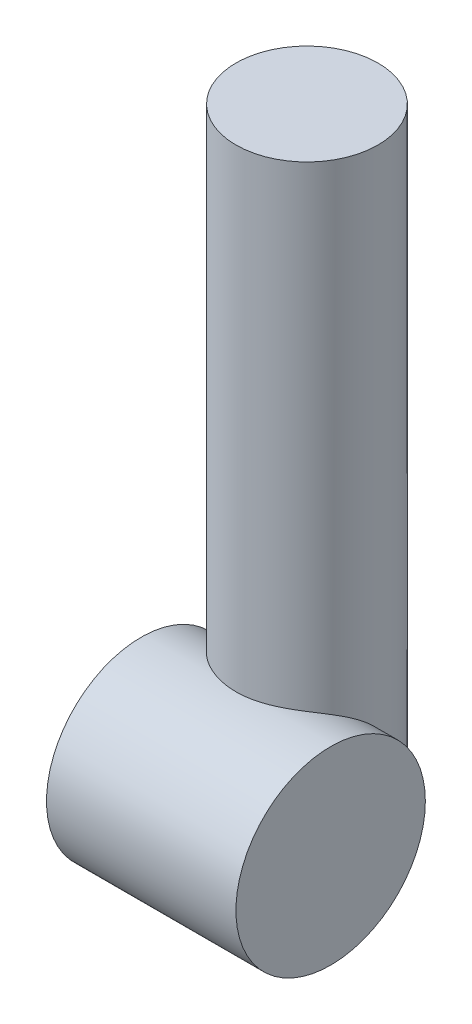
ISO-10303-21;
HEADER;
FILE_DESCRIPTION(('STEP AP214'),'2;1');
FILE_NAME('part.step','',(''),(''),'','','');
FILE_SCHEMA(('AUTOMOTIVE_DESIGN { 1 0 10303 214 1 1 1 1 }'));
ENDSEC;
DATA;
#1=APPLICATION_CONTEXT('core data for automotive mechanical design processes');
#2=APPLICATION_PROTOCOL_DEFINITION('international standard','automotive_design',2000,#1);
#3=PRODUCT_CONTEXT('',#1,'mechanical');
#4=PRODUCT('Part','Part','',(#3));
#5=PRODUCT_RELATED_PRODUCT_CATEGORY('part','',(#4));
#6=PRODUCT_DEFINITION_FORMATION('','',#4);
#7=PRODUCT_DEFINITION_CONTEXT('part definition',#1,'design');
#8=PRODUCT_DEFINITION('design','',#6,#7);
#9=PRODUCT_DEFINITION_SHAPE('','',#8);
#10=(LENGTH_UNIT() NAMED_UNIT(*) SI_UNIT(.MILLI.,.METRE.));
#11=(NAMED_UNIT(*) PLANE_ANGLE_UNIT() SI_UNIT($,.RADIAN.));
#12=(NAMED_UNIT(*) SI_UNIT($,.STERADIAN.) SOLID_ANGLE_UNIT());
#13=UNCERTAINTY_MEASURE_WITH_UNIT(LENGTH_MEASURE(1.E-05),#10,'distance_accuracy_value','');
#14=(GEOMETRIC_REPRESENTATION_CONTEXT(3) GLOBAL_UNCERTAINTY_ASSIGNED_CONTEXT((#13)) GLOBAL_UNIT_ASSIGNED_CONTEXT((#10,
#11,#12)) REPRESENTATION_CONTEXT('',''));
#15=CARTESIAN_POINT('',(0.,0.,0.));
#16=DIRECTION('',(0.,0.,1.));
#17=DIRECTION('',(1.,0.,0.));
#18=AXIS2_PLACEMENT_3D('',#15,#16,#17);
#19=CARTESIAN_POINT('',(0.,240.,0.));
#20=DIRECTION('',(0.,-1.,0.));
#21=DIRECTION('',(0.,0.,-1.));
#22=AXIS2_PLACEMENT_3D('',#19,#20,#21);
#23=CYLINDRICAL_SURFACE('',#22,30.);
#24=CARTESIAN_POINT('',(0.,240.,0.));
#25=DIRECTION('',(0.,1.,0.));
#26=DIRECTION('',(0.,0.,1.));
#27=AXIS2_PLACEMENT_3D('',#24,#25,#26);
#28=CIRCLE('',#27,30.);
#29=CARTESIAN_POINT('',(0.,240.,30.));
#30=VERTEX_POINT('',#29);
#31=EDGE_CURVE('E44',#30,#30,#28,.T.);
#32=ORIENTED_EDGE('',*,*,#31,.F.);
#33=EDGE_LOOP('',(#32));
#34=FACE_BOUND('',#33,.T.);
#35=CARTESIAN_POINT('',(28.2842712474619,0.,-10.));
#36=CARTESIAN_POINT('',(28.284268353884,0.321279484019381,-10.0000001693115));
#37=CARTESIAN_POINT('',(28.2856402245259,0.64254457452302,-9.99612898652597));
#38=CARTESIAN_POINT('',(28.2911069328653,1.28486128617135,-9.98064955979972));
#39=CARTESIAN_POINT('',(28.2952017377202,1.605912909844,-9.9690414091781));
#40=CARTESIAN_POINT('',(28.3115291915471,2.56838958003852,-9.92262429609089));
#41=CARTESIAN_POINT('',(28.3278048943818,3.20922926254307,-9.87622266889922));
#42=CARTESIAN_POINT('',(28.3705667873075,4.48716586979845,-9.7527011091298));
#43=CARTESIAN_POINT('',(28.3970467036467,5.12426485053955,-9.67560005020183));
#44=CARTESIAN_POINT('',(28.459300301829,6.39358236731506,-9.49092820174421));
#45=CARTESIAN_POINT('',(28.4950740724151,7.02580085668841,-9.38335712126867));
#46=CARTESIAN_POINT('',(28.5746449864494,8.28331186477431,-9.1381753902189));
#47=CARTESIAN_POINT('',(28.6184353356872,8.90860977648034,-9.00059015845621));
#48=CARTESIAN_POINT('',(28.7125419599859,10.1514250707658,-8.69571008565138));
#49=CARTESIAN_POINT('',(28.7628583396231,10.7689423284901,-8.52841476850442));
#50=CARTESIAN_POINT('',(28.8682561552566,11.9948696045897,-8.16453709981523));
#51=CARTESIAN_POINT('',(28.9233375202066,12.603279758594,-7.9679551849069));
#52=CARTESIAN_POINT('',(29.0362840012873,13.809693639373,-7.5459828416025));
#53=CARTESIAN_POINT('',(29.0941490216522,14.4076977231847,-7.32059340382832));
#54=CARTESIAN_POINT('',(29.2517903055103,16.0119716423345,-6.67162479510761));
#55=CARTESIAN_POINT('',(29.3522124800024,17.007299105048,-6.22077218905065));
#56=CARTESIAN_POINT('',(29.5432711444032,18.9583540548656,-5.23880934314055));
#57=CARTESIAN_POINT('',(29.6339083128416,19.9140842849574,-4.70770467440923));
#58=CARTESIAN_POINT('',(29.7925048829122,21.778979951127,-3.56885350876599));
#59=CARTESIAN_POINT('',(29.8604960104644,22.6882090074213,-2.96121589040336));
#60=CARTESIAN_POINT('',(29.9603131919302,24.4550858638423,-1.67244212949247));
#61=CARTESIAN_POINT('',(29.992147815908,25.3127458415641,-0.99132344586236));
#62=CARTESIAN_POINT('',(30.0038493488283,26.7855042292648,0.280276721482372));
#63=CARTESIAN_POINT('',(29.9936860773692,27.412175358556,0.857300635505576));
#64=CARTESIAN_POINT('',(29.9358715913989,28.6265579607805,2.04926394447678));
#65=CARTESIAN_POINT('',(29.8882253341085,29.214274574405,2.66419831575887));
#66=CARTESIAN_POINT('',(29.7486318315485,30.3467111809055,3.92710411280617));
#67=CARTESIAN_POINT('',(29.6567138204382,30.8914592715139,4.57505348551306));
#68=CARTESIAN_POINT('',(29.4220819670729,31.9347595452652,5.89852700749255));
#69=CARTESIAN_POINT('',(29.279367502636,32.4333111624752,6.57405149442999));
#70=CARTESIAN_POINT('',(28.9358793549048,33.3850296560662,7.95127355779489));
#71=CARTESIAN_POINT('',(28.7346135308843,33.8377660619996,8.65314714505158));
#72=CARTESIAN_POINT('',(28.2697873861965,34.6902838619548,10.0684520425635));
#73=CARTESIAN_POINT('',(28.0062269185327,35.0900651310149,10.7818833800878));
#74=CARTESIAN_POINT('',(27.4138717976578,35.8350834446939,12.2096946107925));
#75=CARTESIAN_POINT('',(27.0851095496198,36.180347431814,12.9240738583738));
#76=CARTESIAN_POINT('',(26.3611029054408,36.8166827779974,14.3431660889398));
#77=CARTESIAN_POINT('',(25.9658669188482,37.1077609822666,15.0478802824624));
#78=CARTESIAN_POINT('',(25.1678632821099,37.6016604854215,16.3424647202143));
#79=CARTESIAN_POINT('',(24.7733854980382,37.8110973604851,16.9349491551201));
#80=CARTESIAN_POINT('',(23.9370176183278,38.1931038734498,18.0978444570366));
#81=CARTESIAN_POINT('',(23.4951324540886,38.3656773403725,18.6682576115579));
#82=CARTESIAN_POINT('',(22.5662895068384,38.6769439828436,19.780999949084));
#83=CARTESIAN_POINT('',(22.079326339127,38.8156331035873,20.3233257648756));
#84=CARTESIAN_POINT('',(21.0633762192914,39.0626679728314,21.3744825223618));
#85=CARTESIAN_POINT('',(20.5343876531983,39.171012555238,21.8833121762758));
#86=CARTESIAN_POINT('',(19.4399515906344,39.3609144653034,22.8609858914153));
#87=CARTESIAN_POINT('',(18.8746520641592,39.4425731656627,23.3299761433873));
#88=CARTESIAN_POINT('',(17.7094269610404,39.5837214715813,24.2263605729396));
#89=CARTESIAN_POINT('',(17.1095019359087,39.64321143013,24.653755412757));
#90=CARTESIAN_POINT('',(15.8786404722903,39.7440663422456,25.4639306919591));
#91=CARTESIAN_POINT('',(15.2476973986726,39.7854273988962,25.8467015261796));
#92=CARTESIAN_POINT('',(13.9587161025993,39.8538692753493,26.5649900168489));
#93=CARTESIAN_POINT('',(13.3006764321546,39.8809493309325,26.9005051437993));
#94=CARTESIAN_POINT('',(11.9042085867052,39.9262532482419,27.5487163670686));
#95=CARTESIAN_POINT('',(11.1637103855397,39.9435249961352,27.8570268791249));
#96=CARTESIAN_POINT('',(9.66026455119915,39.9694924605538,28.4134100113271));
#97=CARTESIAN_POINT('',(8.89731584751442,39.9781877674431,28.6614797537708));
#98=CARTESIAN_POINT('',(7.35382216357773,39.9903691484068,29.0957753174128));
#99=CARTESIAN_POINT('',(6.57327396936581,39.9938542630633,29.2819897435072));
#100=CARTESIAN_POINT('',(4.99976485215858,39.9982111815267,29.5913044775293));
#101=CARTESIAN_POINT('',(4.20680375063542,39.9990829477127,29.714403876848));
#102=CARTESIAN_POINT('',(2.57607940902554,39.9999926607901,29.9009793016242));
#103=CARTESIAN_POINT('',(1.73796259473966,39.9999894778136,29.9613799645657));
#104=CARTESIAN_POINT('',(0.0595969386442121,40.000005988703,30.0116871549928));
#105=CARTESIAN_POINT('',(-0.780651976733878,40.0000256833694,30.001591215985));
#106=CARTESIAN_POINT('',(-2.45744638778885,39.9999265294938,29.9109677260963));
#107=CARTESIAN_POINT('',(-3.29399143105372,39.9998076644719,29.8304317974918));
#108=CARTESIAN_POINT('',(-4.95737447587965,39.9981610889643,29.5994845802877));
#109=CARTESIAN_POINT('',(-5.78421251387408,39.9966333837682,29.4490735540369));
#110=CARTESIAN_POINT('',(-7.42613230099002,39.9898167863294,29.0785849054882));
#111=CARTESIAN_POINT('',(-8.24114222576628,39.9845105766919,28.8581891201291));
#112=CARTESIAN_POINT('',(-9.84964288958609,39.9667444816957,28.3495332074551));
#113=CARTESIAN_POINT('',(-10.6431333718124,39.9542845110019,28.0612722706217));
#114=CARTESIAN_POINT('',(-12.2029289348991,39.917937211613,27.4189713940793));
#115=CARTESIAN_POINT('',(-12.9692296315955,39.8940480489536,27.0649209031498));
#116=CARTESIAN_POINT('',(-14.4687614027149,39.8298119555961,26.293833280237));
#117=CARTESIAN_POINT('',(-15.2019929999625,39.7894652851938,25.8767971445147));
#118=CARTESIAN_POINT('',(-16.6218721460502,39.6872648208631,24.9881386458622));
#119=CARTESIAN_POINT('',(-17.3089416699847,39.6256512180463,24.5171635801985));
#120=CARTESIAN_POINT('',(-18.6397127312468,39.4750549237724,23.5213027435828));
#121=CARTESIAN_POINT('',(-19.2834143170931,39.3860722629355,22.9964170329459));
#122=CARTESIAN_POINT('',(-20.5217139723533,39.1749604370275,21.8984798073424));
#123=CARTESIAN_POINT('',(-21.1163475074269,39.052855490844,21.3254636956579));
#124=CARTESIAN_POINT('',(-22.2521067402095,38.7698802855782,20.1374978026184));
#125=CARTESIAN_POINT('',(-22.7932372223476,38.6090134971444,19.5225517791064));
#126=CARTESIAN_POINT('',(-23.7816424899566,38.2564712118906,18.3031518231184));
#127=CARTESIAN_POINT('',(-24.2328456129632,38.0677705277973,17.7010192667066));
#128=CARTESIAN_POINT('',(-25.0828648475796,37.6494144622315,16.4744207712343));
#129=CARTESIAN_POINT('',(-25.4816838290392,37.4197613259533,15.849956058021));
#130=CARTESIAN_POINT('',(-26.2252760744213,36.9173690533462,14.58670436273));
#131=CARTESIAN_POINT('',(-26.5700691138101,36.6446457560083,13.9479227194949));
#132=CARTESIAN_POINT('',(-27.2054861911011,36.0549436477084,12.6639102063629));
#133=CARTESIAN_POINT('',(-27.4961117395142,35.7379660712494,12.0186795168324));
#134=CARTESIAN_POINT('',(-28.0069867392464,35.0819274236197,10.7718469561532));
#135=CARTESIAN_POINT('',(-28.2305900643287,34.7456552687992,10.1701444022528));
#136=CARTESIAN_POINT('',(-28.6332073370997,34.0353086843499,8.97426849289932));
#137=CARTESIAN_POINT('',(-28.8122236364468,33.6612362498889,8.38009474192327));
#138=CARTESIAN_POINT('',(-29.128382993685,32.8766501694221,7.20470886214665));
#139=CARTESIAN_POINT('',(-29.2655180447527,32.4661295746249,6.6234992314792));
#140=CARTESIAN_POINT('',(-29.5012279793029,31.6105881612877,5.47896174818396));
#141=CARTESIAN_POINT('',(-29.5998006555106,31.1655653696202,4.91563492084657));
#142=CARTESIAN_POINT('',(-29.7680629490228,30.2098843141915,3.77104449696539));
#143=CARTESIAN_POINT('',(-29.8351541123584,29.6968070258796,3.19142130066817));
#144=CARTESIAN_POINT('',(-29.9344659526018,28.6362920205655,2.06143671321878));
#145=CARTESIAN_POINT('',(-29.9666853769781,28.0888530701,1.51107637381193));
#146=CARTESIAN_POINT('',(-30.0015011616129,26.9621863817429,0.442536525332598));
#147=CARTESIAN_POINT('',(-30.0040849511901,26.3829452588462,-0.0756292349403398));
#148=CARTESIAN_POINT('',(-29.9848385700798,25.1954356625852,-1.07721715449799));
#149=CARTESIAN_POINT('',(-29.9630050885912,24.5871632635021,-1.5606345927074));
#150=CARTESIAN_POINT('',(-29.9125949555938,23.59179992936,-2.30549820592078));
#151=CARTESIAN_POINT('',(-29.8901664713848,23.213095626588,-2.57867401245041));
#152=CARTESIAN_POINT('',(-29.8394185698257,22.4467040893618,-3.11137614662597));
#153=CARTESIAN_POINT('',(-29.811100232208,22.059018512921,-3.37090496513847));
#154=CARTESIAN_POINT('',(-29.7188957436701,20.8830029228024,-4.128724942846));
#155=CARTESIAN_POINT('',(-29.6477604435151,20.081719854475,-4.6062452812254));
#156=CARTESIAN_POINT('',(-29.4943034335841,18.4482543278119,-5.50396146638569));
#157=CARTESIAN_POINT('',(-29.4119753127951,17.6160543609162,-5.92412418147377));
#158=CARTESIAN_POINT('',(-29.2437801051363,15.9244694179108,-6.70530005272564));
#159=CARTESIAN_POINT('',(-29.1579125597745,15.0650809232121,-7.06630551541765));
#160=CARTESIAN_POINT('',(-29.019421863579,13.6309753160625,-7.61062950941495));
#161=CARTESIAN_POINT('',(-28.9657757822503,13.0630034251958,-7.81165181328718));
#162=CARTESIAN_POINT('',(-28.8616673476181,11.9182415511091,-8.18793633972916));
#163=CARTESIAN_POINT('',(-28.8112051418812,11.3414511607054,-8.36319736881277));
#164=CARTESIAN_POINT('',(-28.7150585110775,10.1801145722398,-8.68757945017689));
#165=CARTESIAN_POINT('',(-28.6693745529066,9.59556762253986,-8.83669794895908));
#166=CARTESIAN_POINT('',(-28.5842051545812,8.41989953523418,-9.10842982107918));
#167=CARTESIAN_POINT('',(-28.544719634243,7.82877848277786,-9.23104353729407));
#168=CARTESIAN_POINT('',(-28.4730645711115,6.63952243156278,-9.44975635280757));
#169=CARTESIAN_POINT('',(-28.4409154155202,6.04137262997208,-9.5457817191685));
#170=CARTESIAN_POINT('',(-28.3850598841548,4.84094078549391,-9.71060764299933));
#171=CARTESIAN_POINT('',(-28.3613534633337,4.23865876467174,-9.77940834572909));
#172=CARTESIAN_POINT('',(-28.3231237069062,3.03103627379608,-9.88960403698668));
#173=CARTESIAN_POINT('',(-28.3086043398237,2.42569459571826,-9.93098718233803));
#174=CARTESIAN_POINT('',(-28.2891510900638,1.21357121814001,-9.98619335083263));
#175=CARTESIAN_POINT('',(-28.2842177163991,0.606789443883759,-10.0000149104666));
#176=CARTESIAN_POINT('',(-28.2842712474619,0.,-10.));
#177=B_SPLINE_CURVE_WITH_KNOTS('',3,(#35,#36,#37,#38,#39,#40,#41,#42,#43,#44,#45,#46,#47,#48,
#49,#50,#51,#52,#53,#54,#55,#56,#57,#58,#59,#60,#61,#62,#63,#64,#65,#66,#67,#68,#69,#70,#71,#72,
#73,#74,#75,#76,#77,#78,#79,#80,#81,#82,#83,#84,#85,#86,#87,#88,#89,#90,#91,#92,#93,#94,#95,#96,
#97,#98,#99,#100,#101,#102,#103,#104,#105,#106,#107,#108,#109,#110,#111,#112,#113,#114,#115,
#116,#117,#118,#119,#120,#121,#122,#123,#124,#125,#126,#127,#128,#129,#130,#131,#132,#133,#134,
#135,#136,#137,#138,#139,#140,#141,#142,#143,#144,#145,#146,#147,#148,#149,#150,#151,#152,#153,
#154,#155,#156,#157,#158,#159,#160,#161,#162,#163,#164,#165,#166,#167,#168,#169,#170,#171,#172,
#173,#174,#175,#176),.UNSPECIFIED.,.F.,.F.,(4,2,2,2,2,2,2,2,2,2,2,2,2,2,2,2,2,2,2,2,2,2,2,2,2,2,
2,2,2,2,2,2,2,2,2,2,2,2,2,2,2,2,2,2,2,2,2,2,2,2,2,2,2,2,2,2,2,2,2,2,2,2,2,2,2,2,2,2,2,2,4),(0.,
0.963783539115916,1.92755545381477,3.85482110171334,5.78090371429359,7.70700471887579,
9.63148080881442,11.5559877413107,13.4804659842031,15.4048780666821,18.6928114950417,
21.9805167788681,25.263596593925,28.5458980682292,31.0993616463728,33.6524875791733,
36.2039299018358,38.7554034769865,41.3289751472287,43.9025528903856,46.4748547607362,
49.0468314553353,51.270020621827,53.4929787520713,55.7162027647175,57.9395122007254,
60.1542749415086,62.3690024154659,64.5842057251824,66.7995275650369,69.2037577621999,
71.6081027868804,74.0128904992343,76.4177128301318,78.9356002277647,81.4535757201947,
83.9718507267532,86.490116278427,89.0199982853898,91.5499104711797,94.0802287508704,
96.6105070120215,99.1130956272906,101.6156814427,104.116442286672,106.616979301267,
108.941076527074,111.265046374751,113.588163567412,115.911215968088,118.082747184155,
120.254163842646,122.425995371331,124.597951195464,126.92668462607,129.255501697901,
131.585306558091,133.915427360878,135.317592730902,136.719501281102,139.523340102812,
142.328791724355,145.134607909192,146.948694640519,148.76286538964,150.577213241131,
152.391537620053,154.210844082263,156.030140837255,157.850222936794,159.670401679401),.UNSPECIFIED.);
#178=CARTESIAN_POINT('',(28.2842712474619,0.,-10.));
#179=VERTEX_POINT('',#178);
#180=CARTESIAN_POINT('',(-28.2842712474619,0.,-10.));
#181=VERTEX_POINT('',#180);
#182=EDGE_CURVE('E55',#179,#181,#177,.T.);
#183=ORIENTED_EDGE('',*,*,#182,.F.);
#184=CARTESIAN_POINT('',(0.,0.,0.));
#185=DIRECTION('',(0.,1.,0.));
#186=DIRECTION('',(0.,0.,1.));
#187=AXIS2_PLACEMENT_3D('',#184,#185,#186);
#188=CIRCLE('',#187,30.);
#189=EDGE_CURVE('E50',#179,#181,#188,.T.);
#190=ORIENTED_EDGE('',*,*,#189,.T.);
#191=EDGE_LOOP('',(#183,#190));
#192=FACE_BOUND('',#191,.T.);
#193=ADVANCED_FACE('F36',(#34,#192),#23,.T.);
#194=CARTESIAN_POINT('',(0.,0.,0.));
#195=DIRECTION('',(0.,1.,0.));
#196=DIRECTION('',(0.,0.,1.));
#197=AXIS2_PLACEMENT_3D('',#194,#195,#196);
#198=PLANE('',#197);
#199=DIRECTION('',(-1.,0.,0.));
#200=VECTOR('',#199,1.);
#201=CARTESIAN_POINT('',(40.,0.,-10.));
#202=LINE('',#201,#200);
#203=EDGE_CURVE('E11',#181,#179,#202,.F.);
#204=ORIENTED_EDGE('',*,*,#203,.F.);
#205=ORIENTED_EDGE('',*,*,#189,.F.);
#206=EDGE_LOOP('',(#204,#205));
#207=FACE_BOUND('',#206,.T.);
#208=ADVANCED_FACE('F52',(#207),#198,.F.);
#209=CARTESIAN_POINT('',(0.,240.,0.));
#210=DIRECTION('',(0.,1.,0.));
#211=DIRECTION('',(0.,0.,1.));
#212=AXIS2_PLACEMENT_3D('',#209,#210,#211);
#213=PLANE('',#212);
#214=ORIENTED_EDGE('',*,*,#31,.T.);
#215=EDGE_LOOP('',(#214));
#216=FACE_BOUND('',#215,.T.);
#217=ADVANCED_FACE('F62',(#216),#213,.T.);
#218=CARTESIAN_POINT('',(40.,0.,30.));
#219=DIRECTION('',(-1.,0.,0.));
#220=DIRECTION('',(0.,0.,1.));
#221=AXIS2_PLACEMENT_3D('',#218,#219,#220);
#222=CYLINDRICAL_SURFACE('',#221,40.);
#223=CARTESIAN_POINT('',(40.,0.,30.));
#224=DIRECTION('',(1.,0.,0.));
#225=DIRECTION('',(0.,0.,-1.));
#226=AXIS2_PLACEMENT_3D('',#223,#224,#225);
#227=CIRCLE('',#226,40.);
#228=CARTESIAN_POINT('',(40.,0.,-10.));
#229=VERTEX_POINT('',#228);
#230=EDGE_CURVE('E57',#229,#229,#227,.T.);
#231=ORIENTED_EDGE('',*,*,#230,.F.);
#232=EDGE_LOOP('',(#231));
#233=FACE_BOUND('',#232,.T.);
#234=CARTESIAN_POINT('',(-40.,0.,30.));
#235=DIRECTION('',(1.,0.,0.));
#236=DIRECTION('',(0.,0.,-1.));
#237=AXIS2_PLACEMENT_3D('',#234,#235,#236);
#238=CIRCLE('',#237,40.);
#239=CARTESIAN_POINT('',(-40.,0.,-10.));
#240=VERTEX_POINT('',#239);
#241=EDGE_CURVE('E91',#240,#240,#238,.T.);
#242=ORIENTED_EDGE('',*,*,#241,.T.);
#243=EDGE_LOOP('',(#242));
#244=FACE_BOUND('',#243,.T.);
#245=ORIENTED_EDGE('',*,*,#203,.T.);
#246=ORIENTED_EDGE('',*,*,#182,.T.);
#247=EDGE_LOOP('',(#245,#246));
#248=FACE_BOUND('',#247,.T.);
#249=ADVANCED_FACE('F59',(#233,#244,#248),#222,.T.);
#250=CARTESIAN_POINT('',(40.,0.,30.));
#251=DIRECTION('',(1.,0.,0.));
#252=DIRECTION('',(0.,0.,-1.));
#253=AXIS2_PLACEMENT_3D('',#250,#251,#252);
#254=PLANE('',#253);
#255=ORIENTED_EDGE('',*,*,#230,.T.);
#256=EDGE_LOOP('',(#255));
#257=FACE_BOUND('',#256,.T.);
#258=ADVANCED_FACE('F61',(#257),#254,.T.);
#259=CARTESIAN_POINT('',(-40.,0.,30.));
#260=DIRECTION('',(1.,0.,0.));
#261=DIRECTION('',(0.,0.,-1.));
#262=AXIS2_PLACEMENT_3D('',#259,#260,#261);
#263=PLANE('',#262);
#264=ORIENTED_EDGE('',*,*,#241,.F.);
#265=EDGE_LOOP('',(#264));
#266=FACE_BOUND('',#265,.T.);
#267=ADVANCED_FACE('F69',(#266),#263,.F.);
#268=CLOSED_SHELL('',(#193,#208,#217,#249,#258,#267));
#269=MANIFOLD_SOLID_BREP('B2',#268);
#270=ADVANCED_BREP_SHAPE_REPRESENTATION('',(#18,#269),#14);
#271=SHAPE_DEFINITION_REPRESENTATION(#9,#270);
ENDSEC;
END-ISO-10303-21;
